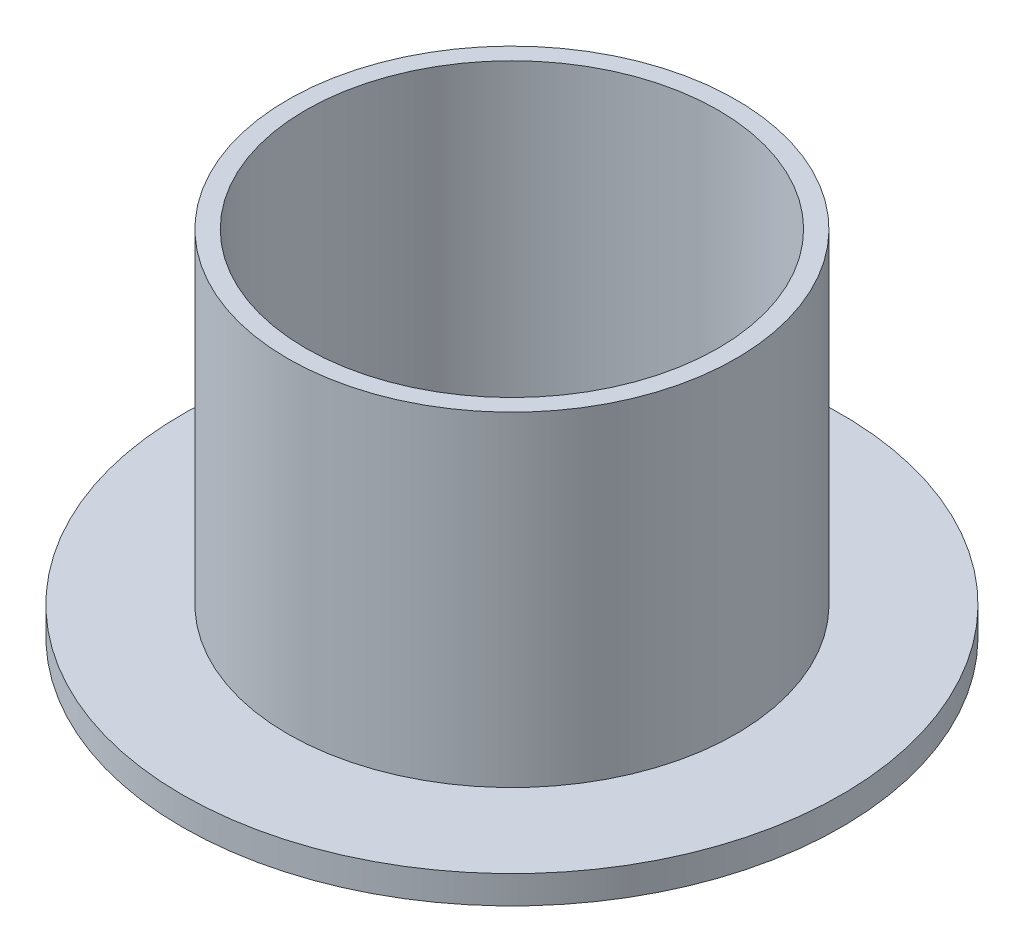
ISO-10303-21;
HEADER;
FILE_DESCRIPTION(('STEP AP214'),'2;1');
FILE_NAME('part.step','',(''),(''),'','','');
FILE_SCHEMA(('AUTOMOTIVE_DESIGN { 1 0 10303 214 1 1 1 1 }'));
ENDSEC;
DATA;
#1=APPLICATION_CONTEXT('core data for automotive mechanical design processes');
#2=APPLICATION_PROTOCOL_DEFINITION('international standard','automotive_design',2000,#1);
#3=PRODUCT_CONTEXT('',#1,'mechanical');
#4=PRODUCT('Part','Part','',(#3));
#5=PRODUCT_RELATED_PRODUCT_CATEGORY('part','',(#4));
#6=PRODUCT_DEFINITION_FORMATION('','',#4);
#7=PRODUCT_DEFINITION_CONTEXT('part definition',#1,'design');
#8=PRODUCT_DEFINITION('design','',#6,#7);
#9=PRODUCT_DEFINITION_SHAPE('','',#8);
#10=(LENGTH_UNIT() NAMED_UNIT(*) SI_UNIT(.MILLI.,.METRE.));
#11=(NAMED_UNIT(*) PLANE_ANGLE_UNIT() SI_UNIT($,.RADIAN.));
#12=(NAMED_UNIT(*) SI_UNIT($,.STERADIAN.) SOLID_ANGLE_UNIT());
#13=UNCERTAINTY_MEASURE_WITH_UNIT(LENGTH_MEASURE(1.E-05),#10,'distance_accuracy_value','');
#14=(GEOMETRIC_REPRESENTATION_CONTEXT(3) GLOBAL_UNCERTAINTY_ASSIGNED_CONTEXT((#13)) GLOBAL_UNIT_ASSIGNED_CONTEXT((#10,
#11,#12)) REPRESENTATION_CONTEXT('',''));
#15=CARTESIAN_POINT('',(0.,0.,0.));
#16=DIRECTION('',(0.,0.,1.));
#17=DIRECTION('',(1.,0.,0.));
#18=AXIS2_PLACEMENT_3D('',#15,#16,#17);
#19=CARTESIAN_POINT('',(0.,40.005,0.));
#20=DIRECTION('',(0.,-1.,0.));
#21=DIRECTION('',(0.,0.,-1.));
#22=AXIS2_PLACEMENT_3D('',#19,#20,#21);
#23=CYLINDRICAL_SURFACE('',#22,23.368);
#24=CARTESIAN_POINT('',(0.,40.005,0.));
#25=DIRECTION('',(0.,1.,0.));
#26=DIRECTION('',(0.,0.,1.));
#27=AXIS2_PLACEMENT_3D('',#24,#25,#26);
#28=CIRCLE('',#27,23.368);
#29=CARTESIAN_POINT('',(0.,40.005,23.368));
#30=VERTEX_POINT('',#29);
#31=EDGE_CURVE('E42',#30,#30,#28,.T.);
#32=ORIENTED_EDGE('',*,*,#31,.T.);
#33=EDGE_LOOP('',(#32));
#34=FACE_BOUND('',#33,.T.);
#35=CARTESIAN_POINT('',(0.,0.,0.));
#36=DIRECTION('',(0.,1.,0.));
#37=DIRECTION('',(0.,0.,1.));
#38=AXIS2_PLACEMENT_3D('',#35,#36,#37);
#39=CIRCLE('',#38,23.368);
#40=CARTESIAN_POINT('',(0.,0.,23.368));
#41=VERTEX_POINT('',#40);
#42=EDGE_CURVE('E38',#41,#41,#39,.T.);
#43=ORIENTED_EDGE('',*,*,#42,.F.);
#44=EDGE_LOOP('',(#43));
#45=FACE_BOUND('',#44,.T.);
#46=ADVANCED_FACE('F35',(#34,#45),#23,.F.);
#47=CARTESIAN_POINT('',(0.,40.005,0.));
#48=DIRECTION('',(0.,-1.,0.));
#49=DIRECTION('',(0.,0.,-1.));
#50=AXIS2_PLACEMENT_3D('',#47,#48,#49);
#51=CYLINDRICAL_SURFACE('',#50,25.4);
#52=CARTESIAN_POINT('',(0.,3.175,0.));
#53=DIRECTION('',(0.,1.,0.));
#54=DIRECTION('',(0.,0.,1.));
#55=AXIS2_PLACEMENT_3D('',#52,#53,#54);
#56=CIRCLE('',#55,25.4);
#57=CARTESIAN_POINT('',(0.,3.175,25.4));
#58=VERTEX_POINT('',#57);
#59=EDGE_CURVE('E51',#58,#58,#56,.T.);
#60=ORIENTED_EDGE('',*,*,#59,.T.);
#61=EDGE_LOOP('',(#60));
#62=FACE_BOUND('',#61,.T.);
#63=CARTESIAN_POINT('',(0.,40.005,0.));
#64=DIRECTION('',(0.,1.,0.));
#65=DIRECTION('',(0.,0.,1.));
#66=AXIS2_PLACEMENT_3D('',#63,#64,#65);
#67=CIRCLE('',#66,25.4);
#68=CARTESIAN_POINT('',(0.,40.005,25.4));
#69=VERTEX_POINT('',#68);
#70=EDGE_CURVE('E10',#69,#69,#67,.T.);
#71=ORIENTED_EDGE('',*,*,#70,.F.);
#72=EDGE_LOOP('',(#71));
#73=FACE_BOUND('',#72,.T.);
#74=ADVANCED_FACE('F58',(#62,#73),#51,.T.);
#75=CARTESIAN_POINT('',(0.,40.005,0.));
#76=DIRECTION('',(0.,1.,0.));
#77=DIRECTION('',(0.,0.,1.));
#78=AXIS2_PLACEMENT_3D('',#75,#76,#77);
#79=PLANE('',#78);
#80=ORIENTED_EDGE('',*,*,#31,.F.);
#81=EDGE_LOOP('',(#80));
#82=FACE_BOUND('',#81,.T.);
#83=ORIENTED_EDGE('',*,*,#70,.T.);
#84=EDGE_LOOP('',(#83));
#85=FACE_BOUND('',#84,.T.);
#86=ADVANCED_FACE('F75',(#82,#85),#79,.T.);
#87=CARTESIAN_POINT('',(0.,0.,0.));
#88=DIRECTION('',(0.,1.,0.));
#89=DIRECTION('',(0.,0.,1.));
#90=AXIS2_PLACEMENT_3D('',#87,#88,#89);
#91=PLANE('',#90);
#92=ORIENTED_EDGE('',*,*,#42,.T.);
#93=EDGE_LOOP('',(#92));
#94=FACE_BOUND('',#93,.T.);
#95=CARTESIAN_POINT('',(0.,0.,0.));
#96=DIRECTION('',(0.,1.,0.));
#97=DIRECTION('',(0.,0.,1.));
#98=AXIS2_PLACEMENT_3D('',#95,#96,#97);
#99=CIRCLE('',#98,37.338);
#100=CARTESIAN_POINT('',(0.,0.,37.338));
#101=VERTEX_POINT('',#100);
#102=EDGE_CURVE('E48',#101,#101,#99,.T.);
#103=ORIENTED_EDGE('',*,*,#102,.F.);
#104=EDGE_LOOP('',(#103));
#105=FACE_BOUND('',#104,.T.);
#106=ADVANCED_FACE('F70',(#94,#105),#91,.F.);
#107=CARTESIAN_POINT('',(0.,3.175,0.));
#108=DIRECTION('',(0.,-1.,0.));
#109=DIRECTION('',(0.,0.,-1.));
#110=AXIS2_PLACEMENT_3D('',#107,#108,#109);
#111=CYLINDRICAL_SURFACE('',#110,37.338);
#112=CARTESIAN_POINT('',(0.,3.175,0.));
#113=DIRECTION('',(0.,1.,0.));
#114=DIRECTION('',(0.,0.,1.));
#115=AXIS2_PLACEMENT_3D('',#112,#113,#114);
#116=CIRCLE('',#115,37.338);
#117=CARTESIAN_POINT('',(0.,3.175,37.338));
#118=VERTEX_POINT('',#117);
#119=EDGE_CURVE('E52',#118,#118,#116,.T.);
#120=ORIENTED_EDGE('',*,*,#119,.F.);
#121=EDGE_LOOP('',(#120));
#122=FACE_BOUND('',#121,.T.);
#123=ORIENTED_EDGE('',*,*,#102,.T.);
#124=EDGE_LOOP('',(#123));
#125=FACE_BOUND('',#124,.T.);
#126=ADVANCED_FACE('F64',(#122,#125),#111,.T.);
#127=CARTESIAN_POINT('',(0.,3.175,0.));
#128=DIRECTION('',(0.,1.,0.));
#129=DIRECTION('',(0.,0.,1.));
#130=AXIS2_PLACEMENT_3D('',#127,#128,#129);
#131=PLANE('',#130);
#132=ORIENTED_EDGE('',*,*,#59,.F.);
#133=EDGE_LOOP('',(#132));
#134=FACE_BOUND('',#133,.T.);
#135=ORIENTED_EDGE('',*,*,#119,.T.);
#136=EDGE_LOOP('',(#135));
#137=FACE_BOUND('',#136,.T.);
#138=ADVANCED_FACE('F61',(#134,#137),#131,.T.);
#139=CLOSED_SHELL('',(#46,#74,#86,#106,#126,#138));
#140=MANIFOLD_SOLID_BREP('B2',#139);
#141=ADVANCED_BREP_SHAPE_REPRESENTATION('',(#18,#140),#14);
#142=SHAPE_DEFINITION_REPRESENTATION(#9,#141);
ENDSEC;
END-ISO-10303-21;
